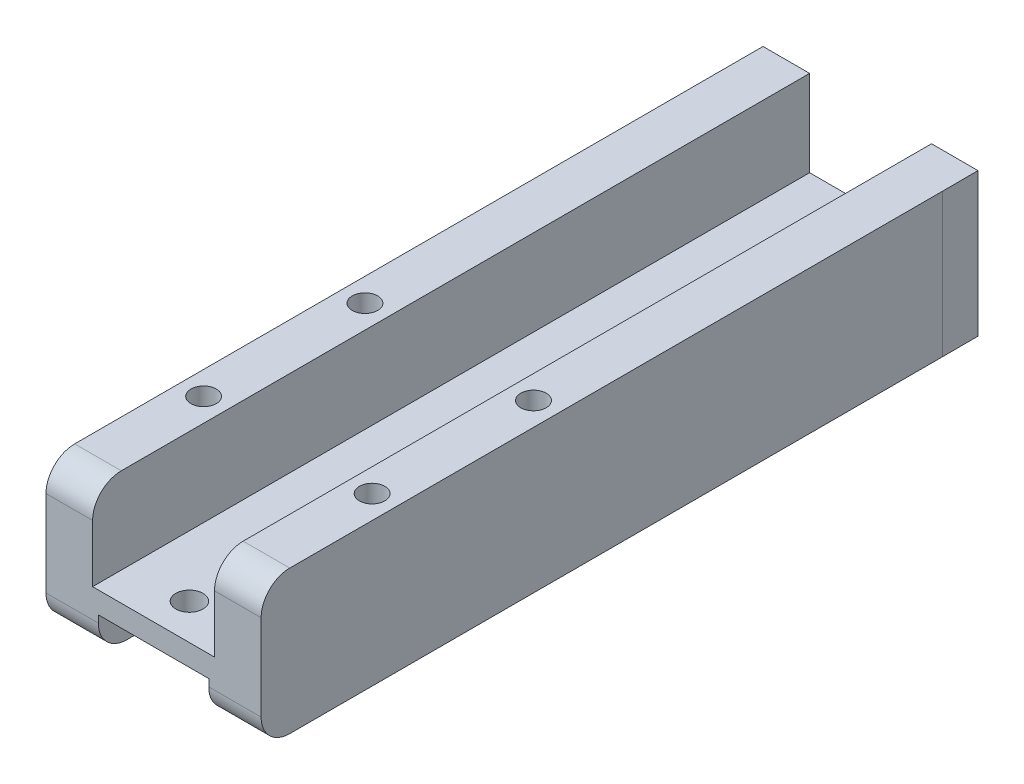
ISO-10303-21;
HEADER;
FILE_DESCRIPTION(('STEP AP214'),'2;1');
FILE_NAME('part.step','',(''),(''),'','','');
FILE_SCHEMA(('AUTOMOTIVE_DESIGN { 1 0 10303 214 1 1 1 1 }'));
ENDSEC;
DATA;
#1=APPLICATION_CONTEXT('core data for automotive mechanical design processes');
#2=APPLICATION_PROTOCOL_DEFINITION('international standard','automotive_design',2000,#1);
#3=PRODUCT_CONTEXT('',#1,'mechanical');
#4=PRODUCT('Part','Part','',(#3));
#5=PRODUCT_RELATED_PRODUCT_CATEGORY('part','',(#4));
#6=PRODUCT_DEFINITION_FORMATION('','',#4);
#7=PRODUCT_DEFINITION_CONTEXT('part definition',#1,'design');
#8=PRODUCT_DEFINITION('design','',#6,#7);
#9=PRODUCT_DEFINITION_SHAPE('','',#8);
#10=(LENGTH_UNIT() NAMED_UNIT(*) SI_UNIT(.MILLI.,.METRE.));
#11=(NAMED_UNIT(*) PLANE_ANGLE_UNIT() SI_UNIT($,.RADIAN.));
#12=(NAMED_UNIT(*) SI_UNIT($,.STERADIAN.) SOLID_ANGLE_UNIT());
#13=UNCERTAINTY_MEASURE_WITH_UNIT(LENGTH_MEASURE(1.E-05),#10,'distance_accuracy_value','');
#14=(GEOMETRIC_REPRESENTATION_CONTEXT(3) GLOBAL_UNCERTAINTY_ASSIGNED_CONTEXT((#13)) GLOBAL_UNIT_ASSIGNED_CONTEXT((#10,
#11,#12)) REPRESENTATION_CONTEXT('',''));
#15=CARTESIAN_POINT('',(0.,0.,0.));
#16=DIRECTION('',(0.,0.,1.));
#17=DIRECTION('',(1.,0.,0.));
#18=AXIS2_PLACEMENT_3D('',#15,#16,#17);
#19=CARTESIAN_POINT('',(0.,0.,0.));
#20=DIRECTION('',(0.,1.,0.));
#21=DIRECTION('',(0.,0.,1.));
#22=AXIS2_PLACEMENT_3D('',#19,#20,#21);
#23=PLANE('',#22);
#24=CARTESIAN_POINT('',(14.9225,0.,7.95562815682645));
#25=DIRECTION('',(0.,1.,0.));
#26=DIRECTION('',(0.,0.,1.));
#27=AXIS2_PLACEMENT_3D('',#24,#25,#26);
#28=CIRCLE('',#27,2.2479);
#29=CARTESIAN_POINT('',(14.9225,0.,10.2035281568264));
#30=VERTEX_POINT('',#29);
#31=EDGE_CURVE('E451',#30,#30,#28,.T.);
#32=ORIENTED_EDGE('',*,*,#31,.T.);
#33=EDGE_LOOP('',(#32));
#34=FACE_BOUND('',#33,.T.);
#35=CARTESIAN_POINT('',(14.9225,0.,36.5306281568265));
#36=DIRECTION('',(0.,1.,0.));
#37=DIRECTION('',(0.,0.,1.));
#38=AXIS2_PLACEMENT_3D('',#35,#36,#37);
#39=CIRCLE('',#38,2.2479);
#40=CARTESIAN_POINT('',(14.9225,0.,38.7785281568264));
#41=VERTEX_POINT('',#40);
#42=EDGE_CURVE('E456',#41,#41,#39,.T.);
#43=ORIENTED_EDGE('',*,*,#42,.T.);
#44=EDGE_LOOP('',(#43));
#45=FACE_BOUND('',#44,.T.);
#46=DIRECTION('',(0.,0.,-1.));
#47=VECTOR('',#46,1.);
#48=CARTESIAN_POINT('',(19.05,0.,60.325));
#49=LINE('',#48,#47);
#50=CARTESIAN_POINT('',(19.05,0.,55.245));
#51=VERTEX_POINT('',#50);
#52=CARTESIAN_POINT('',(19.05,0.,-60.325));
#53=VERTEX_POINT('',#52);
#54=EDGE_CURVE('E236',#51,#53,#49,.T.);
#55=ORIENTED_EDGE('',*,*,#54,.F.);
#56=DIRECTION('',(1.,0.,0.));
#57=VECTOR('',#56,1.);
#58=CARTESIAN_POINT('',(0.,0.,55.245));
#59=LINE('',#58,#57);
#60=CARTESIAN_POINT('',(9.779,0.,55.245));
#61=VERTEX_POINT('',#60);
#62=EDGE_CURVE('E61',#51,#61,#59,.F.);
#63=ORIENTED_EDGE('',*,*,#62,.T.);
#64=DIRECTION('',(0.,0.,-1.));
#65=VECTOR('',#64,1.);
#66=CARTESIAN_POINT('',(9.779,0.,0.));
#67=LINE('',#66,#65);
#68=CARTESIAN_POINT('',(9.779,0.,-66.675));
#69=VERTEX_POINT('',#68);
#70=EDGE_CURVE('E260',#61,#69,#67,.T.);
#71=ORIENTED_EDGE('',*,*,#70,.T.);
#72=DIRECTION('',(-1.,0.,0.));
#73=VECTOR('',#72,1.);
#74=CARTESIAN_POINT('',(-19.05,0.,-66.675));
#75=LINE('',#74,#73);
#76=CARTESIAN_POINT('',(19.0294614987353,0.,-66.675));
#77=VERTEX_POINT('',#76);
#78=EDGE_CURVE('E180',#77,#69,#75,.T.);
#79=ORIENTED_EDGE('',*,*,#78,.F.);
#80=DIRECTION('',(-0.00323439272988773,0.,-0.999994769338155));
#81=VECTOR('',#80,1.);
#82=CARTESIAN_POINT('',(19.0294614987353,0.,-66.675));
#83=LINE('',#82,#81);
#84=EDGE_CURVE('E228',#53,#77,#83,.T.);
#85=ORIENTED_EDGE('',*,*,#84,.F.);
#86=EDGE_LOOP('',(#55,#63,#71,#79,#85));
#87=FACE_BOUND('',#86,.T.);
#88=ADVANCED_FACE('F39',(#34,#45,#87),#23,.F.);
#89=CARTESIAN_POINT('',(19.0294614987353,38.1,-66.675));
#90=DIRECTION('',(-0.999994769338154,0.,0.00323439272988773));
#91=DIRECTION('',(0.00323439272988773,0.,0.999994769338155));
#92=AXIS2_PLACEMENT_3D('',#89,#90,#91);
#93=PLANE('',#92);
#94=DIRECTION('',(0.,-1.,0.));
#95=VECTOR('',#94,1.);
#96=CARTESIAN_POINT('',(19.0294614987353,38.1,-66.675));
#97=LINE('',#96,#95);
#98=CARTESIAN_POINT('',(19.0294614987353,25.4,-66.675));
#99=VERTEX_POINT('',#98);
#100=EDGE_CURVE('E250',#99,#77,#97,.T.);
#101=ORIENTED_EDGE('',*,*,#100,.F.);
#102=DIRECTION('',(0.00323439272988773,0.,0.999994769338155));
#103=VECTOR('',#102,1.);
#104=CARTESIAN_POINT('',(19.0294614987353,25.4,-66.675));
#105=LINE('',#104,#103);
#106=CARTESIAN_POINT('',(19.05,25.4,-60.325));
#107=VERTEX_POINT('',#106);
#108=EDGE_CURVE('E206',#99,#107,#105,.T.);
#109=ORIENTED_EDGE('',*,*,#108,.T.);
#110=DIRECTION('',(0.,-1.,0.));
#111=VECTOR('',#110,1.);
#112=CARTESIAN_POINT('',(19.05,38.1,-60.325));
#113=LINE('',#112,#111);
#114=EDGE_CURVE('E238',#107,#53,#113,.T.);
#115=ORIENTED_EDGE('',*,*,#114,.T.);
#116=ORIENTED_EDGE('',*,*,#84,.T.);
#117=EDGE_LOOP('',(#101,#109,#115,#116));
#118=FACE_BOUND('',#117,.T.);
#119=ADVANCED_FACE('F315',(#118),#93,.F.);
#120=CARTESIAN_POINT('',(-19.05,38.1,-66.675));
#121=DIRECTION('',(0.,0.,1.));
#122=DIRECTION('',(1.,0.,0.));
#123=AXIS2_PLACEMENT_3D('',#120,#121,#122);
#124=PLANE('',#123);
#125=ORIENTED_EDGE('',*,*,#78,.T.);
#126=DIRECTION('',(0.,1.,0.));
#127=VECTOR('',#126,1.);
#128=CARTESIAN_POINT('',(9.779,-6.35,-66.675));
#129=LINE('',#128,#127);
#130=CARTESIAN_POINT('',(9.779,6.35,-66.675));
#131=VERTEX_POINT('',#130);
#132=EDGE_CURVE('E161',#69,#131,#129,.T.);
#133=ORIENTED_EDGE('',*,*,#132,.T.);
#134=DIRECTION('',(-1.,0.,0.));
#135=VECTOR('',#134,1.);
#136=CARTESIAN_POINT('',(-9.779,6.35,-66.675));
#137=LINE('',#136,#135);
#138=CARTESIAN_POINT('',(-9.779,6.35,-66.675));
#139=VERTEX_POINT('',#138);
#140=EDGE_CURVE('E172',#131,#139,#137,.T.);
#141=ORIENTED_EDGE('',*,*,#140,.T.);
#142=DIRECTION('',(0.,-1.,0.));
#143=VECTOR('',#142,1.);
#144=CARTESIAN_POINT('',(-9.779,-6.35,-66.675));
#145=LINE('',#144,#143);
#146=CARTESIAN_POINT('',(-9.779,0.,-66.675));
#147=VERTEX_POINT('',#146);
#148=EDGE_CURVE('E169',#139,#147,#145,.T.);
#149=ORIENTED_EDGE('',*,*,#148,.T.);
#150=CARTESIAN_POINT('',(-19.05,0.,-66.675));
#151=VERTEX_POINT('',#150);
#152=EDGE_CURVE('E231',#147,#151,#75,.T.);
#153=ORIENTED_EDGE('',*,*,#152,.T.);
#154=DIRECTION('',(0.,-1.,0.));
#155=VECTOR('',#154,1.);
#156=CARTESIAN_POINT('',(-19.05,38.1,-66.675));
#157=LINE('',#156,#155);
#158=CARTESIAN_POINT('',(-19.05,25.4,-66.675));
#159=VERTEX_POINT('',#158);
#160=EDGE_CURVE('E247',#159,#151,#157,.T.);
#161=ORIENTED_EDGE('',*,*,#160,.F.);
#162=DIRECTION('',(1.,0.,0.));
#163=VECTOR('',#162,1.);
#164=CARTESIAN_POINT('',(-19.05,25.4,-66.675));
#165=LINE('',#164,#163);
#166=CARTESIAN_POINT('',(-10.795,25.4,-66.675));
#167=VERTEX_POINT('',#166);
#168=EDGE_CURVE('E198',#159,#167,#165,.T.);
#169=ORIENTED_EDGE('',*,*,#168,.T.);
#170=DIRECTION('',(0.,-1.,0.));
#171=VECTOR('',#170,1.);
#172=CARTESIAN_POINT('',(-10.795,38.1,-66.675));
#173=LINE('',#172,#171);
#174=CARTESIAN_POINT('',(-10.795,10.16,-66.675));
#175=VERTEX_POINT('',#174);
#176=EDGE_CURVE('E218',#167,#175,#173,.T.);
#177=ORIENTED_EDGE('',*,*,#176,.T.);
#178=DIRECTION('',(1.,0.,0.));
#179=VECTOR('',#178,1.);
#180=CARTESIAN_POINT('',(-19.05,10.16,-66.675));
#181=LINE('',#180,#179);
#182=CARTESIAN_POINT('',(10.795,10.16,-66.675));
#183=VERTEX_POINT('',#182);
#184=EDGE_CURVE('E225',#175,#183,#181,.T.);
#185=ORIENTED_EDGE('',*,*,#184,.T.);
#186=DIRECTION('',(0.,1.,0.));
#187=VECTOR('',#186,1.);
#188=CARTESIAN_POINT('',(10.795,38.1,-66.675));
#189=LINE('',#188,#187);
#190=CARTESIAN_POINT('',(10.795,25.4,-66.675));
#191=VERTEX_POINT('',#190);
#192=EDGE_CURVE('E222',#183,#191,#189,.T.);
#193=ORIENTED_EDGE('',*,*,#192,.T.);
#194=EDGE_CURVE('E204',#191,#99,#165,.T.);
#195=ORIENTED_EDGE('',*,*,#194,.T.);
#196=ORIENTED_EDGE('',*,*,#100,.T.);
#197=EDGE_LOOP('',(#125,#133,#141,#149,#153,#161,#169,#177,#185,#193,#195,#196));
#198=FACE_BOUND('',#197,.T.);
#199=ADVANCED_FACE('F178',(#198),#124,.F.);
#200=CARTESIAN_POINT('',(-19.05,38.1,60.325));
#201=DIRECTION('',(1.,0.,0.));
#202=DIRECTION('',(0.,0.,-1.));
#203=AXIS2_PLACEMENT_3D('',#200,#201,#202);
#204=PLANE('',#203);
#205=DIRECTION('',(0.,-1.,0.));
#206=VECTOR('',#205,1.);
#207=CARTESIAN_POINT('',(-19.05,38.1,60.325));
#208=LINE('',#207,#206);
#209=CARTESIAN_POINT('',(-19.05,20.32,60.325));
#210=VERTEX_POINT('',#209);
#211=CARTESIAN_POINT('',(-19.05,5.08000000000002,60.325));
#212=VERTEX_POINT('',#211);
#213=EDGE_CURVE('E244',#210,#212,#208,.T.);
#214=ORIENTED_EDGE('',*,*,#213,.F.);
#215=CARTESIAN_POINT('',(-19.05,20.32,55.245));
#216=DIRECTION('',(1.,0.,0.));
#217=DIRECTION('',(0.,0.,-1.));
#218=AXIS2_PLACEMENT_3D('',#215,#216,#217);
#219=CIRCLE('',#218,5.08);
#220=CARTESIAN_POINT('',(-19.05,25.4,55.245));
#221=VERTEX_POINT('',#220);
#222=EDGE_CURVE('E293',#210,#221,#219,.F.);
#223=ORIENTED_EDGE('',*,*,#222,.T.);
#224=DIRECTION('',(0.,0.,1.));
#225=VECTOR('',#224,1.);
#226=CARTESIAN_POINT('',(-19.05,25.4,60.325));
#227=LINE('',#226,#225);
#228=EDGE_CURVE('E193',#159,#221,#227,.T.);
#229=ORIENTED_EDGE('',*,*,#228,.F.);
#230=ORIENTED_EDGE('',*,*,#160,.T.);
#231=DIRECTION('',(0.,0.,1.));
#232=VECTOR('',#231,1.);
#233=CARTESIAN_POINT('',(-19.05,0.,60.325));
#234=LINE('',#233,#232);
#235=CARTESIAN_POINT('',(-19.05,0.,55.245));
#236=VERTEX_POINT('',#235);
#237=EDGE_CURVE('E233',#151,#236,#234,.T.);
#238=ORIENTED_EDGE('',*,*,#237,.T.);
#239=CARTESIAN_POINT('',(-19.05,5.08,55.245));
#240=DIRECTION('',(1.,0.,0.));
#241=DIRECTION('',(0.,0.,-1.));
#242=AXIS2_PLACEMENT_3D('',#239,#240,#241);
#243=CIRCLE('',#242,5.08);
#244=EDGE_CURVE('E291',#236,#212,#243,.F.);
#245=ORIENTED_EDGE('',*,*,#244,.T.);
#246=EDGE_LOOP('',(#214,#223,#229,#230,#238,#245));
#247=FACE_BOUND('',#246,.T.);
#248=ADVANCED_FACE('F345',(#247),#204,.F.);
#249=CARTESIAN_POINT('',(-19.05,38.1,60.325));
#250=DIRECTION('',(0.,0.,-1.));
#251=DIRECTION('',(-1.,0.,0.));
#252=AXIS2_PLACEMENT_3D('',#249,#250,#251);
#253=PLANE('',#252);
#254=DIRECTION('',(0.,-1.,0.));
#255=VECTOR('',#254,1.);
#256=CARTESIAN_POINT('',(19.05,38.1,60.325));
#257=LINE('',#256,#255);
#258=CARTESIAN_POINT('',(19.05,20.32,60.325));
#259=VERTEX_POINT('',#258);
#260=CARTESIAN_POINT('',(19.05,5.08000000000002,60.325));
#261=VERTEX_POINT('',#260);
#262=EDGE_CURVE('E241',#259,#261,#257,.T.);
#263=ORIENTED_EDGE('',*,*,#262,.F.);
#264=DIRECTION('',(-1.,0.,0.));
#265=VECTOR('',#264,1.);
#266=CARTESIAN_POINT('',(-19.05,20.32,60.325));
#267=LINE('',#266,#265);
#268=CARTESIAN_POINT('',(10.795,20.32,60.325));
#269=VERTEX_POINT('',#268);
#270=EDGE_CURVE('E280',#259,#269,#267,.T.);
#271=ORIENTED_EDGE('',*,*,#270,.T.);
#272=DIRECTION('',(0.,-1.,0.));
#273=VECTOR('',#272,1.);
#274=CARTESIAN_POINT('',(10.795,38.1,60.325));
#275=LINE('',#274,#273);
#276=CARTESIAN_POINT('',(10.795,10.16,60.325));
#277=VERTEX_POINT('',#276);
#278=EDGE_CURVE('E220',#269,#277,#275,.T.);
#279=ORIENTED_EDGE('',*,*,#278,.T.);
#280=DIRECTION('',(-1.,0.,0.));
#281=VECTOR('',#280,1.);
#282=CARTESIAN_POINT('',(-19.05,10.16,60.325));
#283=LINE('',#282,#281);
#284=CARTESIAN_POINT('',(-10.795,10.16,60.325));
#285=VERTEX_POINT('',#284);
#286=EDGE_CURVE('E252',#277,#285,#283,.T.);
#287=ORIENTED_EDGE('',*,*,#286,.T.);
#288=DIRECTION('',(0.,1.,0.));
#289=VECTOR('',#288,1.);
#290=CARTESIAN_POINT('',(-10.795,38.1,60.325));
#291=LINE('',#290,#289);
#292=CARTESIAN_POINT('',(-10.795,20.32,60.325));
#293=VERTEX_POINT('',#292);
#294=EDGE_CURVE('E215',#285,#293,#291,.T.);
#295=ORIENTED_EDGE('',*,*,#294,.T.);
#296=DIRECTION('',(-1.,0.,0.));
#297=VECTOR('',#296,1.);
#298=CARTESIAN_POINT('',(-19.05,20.32,60.325));
#299=LINE('',#298,#297);
#300=EDGE_CURVE('E277',#293,#210,#299,.T.);
#301=ORIENTED_EDGE('',*,*,#300,.T.);
#302=ORIENTED_EDGE('',*,*,#213,.T.);
#303=DIRECTION('',(1.,0.,0.));
#304=VECTOR('',#303,1.);
#305=CARTESIAN_POINT('',(-19.05,5.08,60.325));
#306=LINE('',#305,#304);
#307=CARTESIAN_POINT('',(-9.779,5.08,60.325));
#308=VERTEX_POINT('',#307);
#309=EDGE_CURVE('E262',#212,#308,#306,.T.);
#310=ORIENTED_EDGE('',*,*,#309,.T.);
#311=DIRECTION('',(0.,-1.,0.));
#312=VECTOR('',#311,1.);
#313=CARTESIAN_POINT('',(-9.779,-6.35,60.325));
#314=LINE('',#313,#312);
#315=CARTESIAN_POINT('',(-9.779,6.35,60.325));
#316=VERTEX_POINT('',#315);
#317=EDGE_CURVE('E181',#316,#308,#314,.T.);
#318=ORIENTED_EDGE('',*,*,#317,.F.);
#319=DIRECTION('',(-1.,0.,0.));
#320=VECTOR('',#319,1.);
#321=CARTESIAN_POINT('',(-9.779,6.35,60.325));
#322=LINE('',#321,#320);
#323=CARTESIAN_POINT('',(9.779,6.35,60.325));
#324=VERTEX_POINT('',#323);
#325=EDGE_CURVE('E183',#324,#316,#322,.T.);
#326=ORIENTED_EDGE('',*,*,#325,.F.);
#327=DIRECTION('',(0.,1.,0.));
#328=VECTOR('',#327,1.);
#329=CARTESIAN_POINT('',(9.779,-6.35,60.325));
#330=LINE('',#329,#328);
#331=CARTESIAN_POINT('',(9.779,5.08,60.325));
#332=VERTEX_POINT('',#331);
#333=EDGE_CURVE('E164',#332,#324,#330,.T.);
#334=ORIENTED_EDGE('',*,*,#333,.F.);
#335=DIRECTION('',(1.,0.,0.));
#336=VECTOR('',#335,1.);
#337=CARTESIAN_POINT('',(-19.05,5.08,60.325));
#338=LINE('',#337,#336);
#339=EDGE_CURVE('E274',#332,#261,#338,.T.);
#340=ORIENTED_EDGE('',*,*,#339,.T.);
#341=EDGE_LOOP('',(#263,#271,#279,#287,#295,#301,#302,#310,#318,#326,#334,#340));
#342=FACE_BOUND('',#341,.T.);
#343=ADVANCED_FACE('F306',(#342),#253,.F.);
#344=CARTESIAN_POINT('',(19.05,38.1,60.325));
#345=DIRECTION('',(-1.,0.,0.));
#346=DIRECTION('',(0.,0.,1.));
#347=AXIS2_PLACEMENT_3D('',#344,#345,#346);
#348=PLANE('',#347);
#349=DIRECTION('',(0.,0.,1.));
#350=VECTOR('',#349,1.);
#351=CARTESIAN_POINT('',(19.05,25.4,-71.3772741349769));
#352=LINE('',#351,#350);
#353=CARTESIAN_POINT('',(19.05,25.4,55.245));
#354=VERTEX_POINT('',#353);
#355=EDGE_CURVE('E195',#107,#354,#352,.T.);
#356=ORIENTED_EDGE('',*,*,#355,.T.);
#357=CARTESIAN_POINT('',(19.05,20.32,55.245));
#358=DIRECTION('',(-1.,0.,0.));
#359=DIRECTION('',(0.,0.,1.));
#360=AXIS2_PLACEMENT_3D('',#357,#358,#359);
#361=CIRCLE('',#360,5.08);
#362=EDGE_CURVE('E289',#354,#259,#361,.F.);
#363=ORIENTED_EDGE('',*,*,#362,.T.);
#364=ORIENTED_EDGE('',*,*,#262,.T.);
#365=CARTESIAN_POINT('',(19.05,5.08,55.245));
#366=DIRECTION('',(-1.,0.,0.));
#367=DIRECTION('',(0.,0.,1.));
#368=AXIS2_PLACEMENT_3D('',#365,#366,#367);
#369=CIRCLE('',#368,5.08);
#370=EDGE_CURVE('E287',#261,#51,#369,.F.);
#371=ORIENTED_EDGE('',*,*,#370,.T.);
#372=ORIENTED_EDGE('',*,*,#54,.T.);
#373=ORIENTED_EDGE('',*,*,#114,.F.);
#374=EDGE_LOOP('',(#356,#363,#364,#371,#372,#373));
#375=FACE_BOUND('',#374,.T.);
#376=ADVANCED_FACE('F310',(#375),#348,.F.);
#377=CARTESIAN_POINT('',(-14.9225,0.,36.5306281568265));
#378=DIRECTION('',(0.,1.,0.));
#379=DIRECTION('',(0.,0.,1.));
#380=AXIS2_PLACEMENT_3D('',#377,#378,#379);
#381=CIRCLE('',#380,2.24789999999999);
#382=CARTESIAN_POINT('',(-14.9225,0.,38.7785281568265));
#383=VERTEX_POINT('',#382);
#384=EDGE_CURVE('E387',#383,#383,#381,.T.);
#385=ORIENTED_EDGE('',*,*,#384,.T.);
#386=EDGE_LOOP('',(#385));
#387=FACE_BOUND('',#386,.T.);
#388=CARTESIAN_POINT('',(-14.9225,0.,7.95562815682647));
#389=DIRECTION('',(0.,1.,0.));
#390=DIRECTION('',(0.,0.,1.));
#391=AXIS2_PLACEMENT_3D('',#388,#389,#390);
#392=CIRCLE('',#391,2.24789999999999);
#393=CARTESIAN_POINT('',(-14.9225,0.,10.2035281568265));
#394=VERTEX_POINT('',#393);
#395=EDGE_CURVE('E391',#394,#394,#392,.T.);
#396=ORIENTED_EDGE('',*,*,#395,.T.);
#397=EDGE_LOOP('',(#396));
#398=FACE_BOUND('',#397,.T.);
#399=DIRECTION('',(0.,0.,1.));
#400=VECTOR('',#399,1.);
#401=CARTESIAN_POINT('',(-9.779,0.,0.));
#402=LINE('',#401,#400);
#403=CARTESIAN_POINT('',(-9.779,0.,55.245));
#404=VERTEX_POINT('',#403);
#405=EDGE_CURVE('E258',#147,#404,#402,.T.);
#406=ORIENTED_EDGE('',*,*,#405,.T.);
#407=DIRECTION('',(1.,0.,0.));
#408=VECTOR('',#407,1.);
#409=CARTESIAN_POINT('',(0.,0.,55.245));
#410=LINE('',#409,#408);
#411=EDGE_CURVE('E11',#404,#236,#410,.F.);
#412=ORIENTED_EDGE('',*,*,#411,.T.);
#413=ORIENTED_EDGE('',*,*,#237,.F.);
#414=ORIENTED_EDGE('',*,*,#152,.F.);
#415=EDGE_LOOP('',(#406,#412,#413,#414));
#416=FACE_BOUND('',#415,.T.);
#417=ADVANCED_FACE('F365',(#387,#398,#416),#23,.F.);
#418=CARTESIAN_POINT('',(0.,10.16,0.));
#419=DIRECTION('',(0.,-1.,0.));
#420=DIRECTION('',(0.,0.,-1.));
#421=AXIS2_PLACEMENT_3D('',#418,#419,#420);
#422=PLANE('',#421);
#423=CARTESIAN_POINT('',(0.,10.16,53.975));
#424=DIRECTION('',(0.,1.,0.));
#425=DIRECTION('',(0.,0.,1.));
#426=AXIS2_PLACEMENT_3D('',#423,#424,#425);
#427=CIRCLE('',#426,2.413);
#428=CARTESIAN_POINT('',(0.,10.16,56.388));
#429=VERTEX_POINT('',#428);
#430=EDGE_CURVE('E267',#429,#429,#427,.T.);
#431=ORIENTED_EDGE('',*,*,#430,.F.);
#432=EDGE_LOOP('',(#431));
#433=FACE_BOUND('',#432,.T.);
#434=CARTESIAN_POINT('',(0.,10.16,-47.625));
#435=DIRECTION('',(0.,1.,0.));
#436=DIRECTION('',(0.,0.,1.));
#437=AXIS2_PLACEMENT_3D('',#434,#435,#436);
#438=CIRCLE('',#437,2.413);
#439=CARTESIAN_POINT('',(0.,10.16,-45.212));
#440=VERTEX_POINT('',#439);
#441=EDGE_CURVE('E460',#440,#440,#438,.T.);
#442=ORIENTED_EDGE('',*,*,#441,.F.);
#443=EDGE_LOOP('',(#442));
#444=FACE_BOUND('',#443,.T.);
#445=CARTESIAN_POINT('',(0.,10.16,3.17499999999998));
#446=DIRECTION('',(0.,1.,0.));
#447=DIRECTION('',(0.,0.,1.));
#448=AXIS2_PLACEMENT_3D('',#445,#446,#447);
#449=CIRCLE('',#448,2.413);
#450=CARTESIAN_POINT('',(0.,10.16,5.58799999999998));
#451=VERTEX_POINT('',#450);
#452=EDGE_CURVE('E186',#451,#451,#449,.T.);
#453=ORIENTED_EDGE('',*,*,#452,.F.);
#454=EDGE_LOOP('',(#453));
#455=FACE_BOUND('',#454,.T.);
#456=DIRECTION('',(0.,0.,1.));
#457=VECTOR('',#456,1.);
#458=CARTESIAN_POINT('',(-10.795,10.16,158.75));
#459=LINE('',#458,#457);
#460=EDGE_CURVE('E212',#175,#285,#459,.T.);
#461=ORIENTED_EDGE('',*,*,#460,.T.);
#462=ORIENTED_EDGE('',*,*,#286,.F.);
#463=DIRECTION('',(0.,0.,-1.));
#464=VECTOR('',#463,1.);
#465=CARTESIAN_POINT('',(10.795,10.16,158.75));
#466=LINE('',#465,#464);
#467=EDGE_CURVE('E209',#277,#183,#466,.T.);
#468=ORIENTED_EDGE('',*,*,#467,.T.);
#469=ORIENTED_EDGE('',*,*,#184,.F.);
#470=EDGE_LOOP('',(#461,#462,#468,#469));
#471=FACE_BOUND('',#470,.T.);
#472=ADVANCED_FACE('F330',(#433,#444,#455,#471),#422,.F.);
#473=CARTESIAN_POINT('',(10.795,10.16,158.75));
#474=DIRECTION('',(1.,0.,0.));
#475=DIRECTION('',(0.,0.,-1.));
#476=AXIS2_PLACEMENT_3D('',#473,#474,#475);
#477=PLANE('',#476);
#478=ORIENTED_EDGE('',*,*,#278,.F.);
#479=CARTESIAN_POINT('',(10.795,20.32,55.245));
#480=DIRECTION('',(1.,0.,0.));
#481=DIRECTION('',(0.,0.,-1.));
#482=AXIS2_PLACEMENT_3D('',#479,#480,#481);
#483=CIRCLE('',#482,5.08);
#484=CARTESIAN_POINT('',(10.795,25.4,55.245));
#485=VERTEX_POINT('',#484);
#486=EDGE_CURVE('E283',#269,#485,#483,.F.);
#487=ORIENTED_EDGE('',*,*,#486,.T.);
#488=DIRECTION('',(0.,0.,-1.));
#489=VECTOR('',#488,1.);
#490=CARTESIAN_POINT('',(10.795,25.4,158.75));
#491=LINE('',#490,#489);
#492=EDGE_CURVE('E203',#485,#191,#491,.T.);
#493=ORIENTED_EDGE('',*,*,#492,.T.);
#494=ORIENTED_EDGE('',*,*,#192,.F.);
#495=ORIENTED_EDGE('',*,*,#467,.F.);
#496=EDGE_LOOP('',(#478,#487,#493,#494,#495));
#497=FACE_BOUND('',#496,.T.);
#498=ADVANCED_FACE('F326',(#497),#477,.F.);
#499=CARTESIAN_POINT('',(-10.795,10.16,158.75));
#500=DIRECTION('',(-1.,0.,0.));
#501=DIRECTION('',(0.,0.,1.));
#502=AXIS2_PLACEMENT_3D('',#499,#500,#501);
#503=PLANE('',#502);
#504=DIRECTION('',(0.,0.,1.));
#505=VECTOR('',#504,1.);
#506=CARTESIAN_POINT('',(-10.795,25.4,158.75));
#507=LINE('',#506,#505);
#508=CARTESIAN_POINT('',(-10.795,25.4,55.245));
#509=VERTEX_POINT('',#508);
#510=EDGE_CURVE('E255',#167,#509,#507,.T.);
#511=ORIENTED_EDGE('',*,*,#510,.T.);
#512=CARTESIAN_POINT('',(-10.795,20.32,55.245));
#513=DIRECTION('',(-1.,0.,0.));
#514=DIRECTION('',(0.,0.,1.));
#515=AXIS2_PLACEMENT_3D('',#512,#513,#514);
#516=CIRCLE('',#515,5.08);
#517=EDGE_CURVE('E297',#509,#293,#516,.F.);
#518=ORIENTED_EDGE('',*,*,#517,.T.);
#519=ORIENTED_EDGE('',*,*,#294,.F.);
#520=ORIENTED_EDGE('',*,*,#460,.F.);
#521=ORIENTED_EDGE('',*,*,#176,.F.);
#522=EDGE_LOOP('',(#511,#518,#519,#520,#521));
#523=FACE_BOUND('',#522,.T.);
#524=ADVANCED_FACE('F336',(#523),#503,.F.);
#525=CARTESIAN_POINT('',(19.05,25.4,60.325));
#526=DIRECTION('',(0.,-1.,0.));
#527=DIRECTION('',(0.,0.,-1.));
#528=AXIS2_PLACEMENT_3D('',#525,#526,#527);
#529=PLANE('',#528);
#530=CARTESIAN_POINT('',(-14.9225,25.4,36.5306281568265));
#531=DIRECTION('',(0.,1.,0.));
#532=DIRECTION('',(0.,0.,1.));
#533=AXIS2_PLACEMENT_3D('',#530,#531,#532);
#534=CIRCLE('',#533,2.24789999999999);
#535=CARTESIAN_POINT('',(-14.9225,25.4,38.7785281568264));
#536=VERTEX_POINT('',#535);
#537=EDGE_CURVE('E440',#536,#536,#534,.T.);
#538=ORIENTED_EDGE('',*,*,#537,.F.);
#539=EDGE_LOOP('',(#538));
#540=FACE_BOUND('',#539,.T.);
#541=CARTESIAN_POINT('',(-14.9225,25.4,7.95562815682647));
#542=DIRECTION('',(0.,1.,0.));
#543=DIRECTION('',(0.,0.,1.));
#544=AXIS2_PLACEMENT_3D('',#541,#542,#543);
#545=CIRCLE('',#544,2.24789999999999);
#546=CARTESIAN_POINT('',(-14.9225,25.4,10.2035281568265));
#547=VERTEX_POINT('',#546);
#548=EDGE_CURVE('E442',#547,#547,#545,.T.);
#549=ORIENTED_EDGE('',*,*,#548,.F.);
#550=EDGE_LOOP('',(#549));
#551=FACE_BOUND('',#550,.T.);
#552=ORIENTED_EDGE('',*,*,#228,.T.);
#553=DIRECTION('',(-1.,0.,0.));
#554=VECTOR('',#553,1.);
#555=CARTESIAN_POINT('',(19.05,25.4,55.245));
#556=LINE('',#555,#554);
#557=EDGE_CURVE('E295',#221,#509,#556,.F.);
#558=ORIENTED_EDGE('',*,*,#557,.T.);
#559=ORIENTED_EDGE('',*,*,#510,.F.);
#560=ORIENTED_EDGE('',*,*,#168,.F.);
#561=EDGE_LOOP('',(#552,#558,#559,#560));
#562=FACE_BOUND('',#561,.T.);
#563=ADVANCED_FACE('F347',(#540,#551,#562),#529,.F.);
#564=CARTESIAN_POINT('',(14.9225,25.4,7.95562815682645));
#565=DIRECTION('',(0.,1.,0.));
#566=DIRECTION('',(0.,0.,1.));
#567=AXIS2_PLACEMENT_3D('',#564,#565,#566);
#568=CIRCLE('',#567,2.24789999999998);
#569=CARTESIAN_POINT('',(14.9225,25.4,10.2035281568264));
#570=VERTEX_POINT('',#569);
#571=EDGE_CURVE('E448',#570,#570,#568,.T.);
#572=ORIENTED_EDGE('',*,*,#571,.F.);
#573=EDGE_LOOP('',(#572));
#574=FACE_BOUND('',#573,.T.);
#575=CARTESIAN_POINT('',(14.9225,25.4,36.5306281568265));
#576=DIRECTION('',(0.,1.,0.));
#577=DIRECTION('',(0.,0.,1.));
#578=AXIS2_PLACEMENT_3D('',#575,#576,#577);
#579=CIRCLE('',#578,2.24789999999999);
#580=CARTESIAN_POINT('',(14.9225,25.4,38.7785281568264));
#581=VERTEX_POINT('',#580);
#582=EDGE_CURVE('E453',#581,#581,#579,.T.);
#583=ORIENTED_EDGE('',*,*,#582,.F.);
#584=EDGE_LOOP('',(#583));
#585=FACE_BOUND('',#584,.T.);
#586=ORIENTED_EDGE('',*,*,#492,.F.);
#587=DIRECTION('',(-1.,0.,0.));
#588=VECTOR('',#587,1.);
#589=CARTESIAN_POINT('',(19.05,25.4,55.245));
#590=LINE('',#589,#588);
#591=EDGE_CURVE('E285',#485,#354,#590,.F.);
#592=ORIENTED_EDGE('',*,*,#591,.T.);
#593=ORIENTED_EDGE('',*,*,#355,.F.);
#594=ORIENTED_EDGE('',*,*,#108,.F.);
#595=ORIENTED_EDGE('',*,*,#194,.F.);
#596=EDGE_LOOP('',(#586,#592,#593,#594,#595));
#597=FACE_BOUND('',#596,.T.);
#598=ADVANCED_FACE('F349',(#574,#585,#597),#529,.F.);
#599=CARTESIAN_POINT('',(9.779,-6.35,-66.675));
#600=DIRECTION('',(1.,0.,0.));
#601=DIRECTION('',(0.,0.,-1.));
#602=AXIS2_PLACEMENT_3D('',#599,#600,#601);
#603=PLANE('',#602);
#604=ORIENTED_EDGE('',*,*,#70,.F.);
#605=CARTESIAN_POINT('',(9.779,5.08,55.245));
#606=DIRECTION('',(1.,0.,0.));
#607=DIRECTION('',(0.,0.,-1.));
#608=AXIS2_PLACEMENT_3D('',#605,#606,#607);
#609=CIRCLE('',#608,5.08);
#610=EDGE_CURVE('E300',#61,#332,#609,.F.);
#611=ORIENTED_EDGE('',*,*,#610,.T.);
#612=ORIENTED_EDGE('',*,*,#333,.T.);
#613=DIRECTION('',(0.,0.,1.));
#614=VECTOR('',#613,1.);
#615=CARTESIAN_POINT('',(9.779,6.35,-66.675));
#616=LINE('',#615,#614);
#617=EDGE_CURVE('E157',#131,#324,#616,.T.);
#618=ORIENTED_EDGE('',*,*,#617,.F.);
#619=ORIENTED_EDGE('',*,*,#132,.F.);
#620=EDGE_LOOP('',(#604,#611,#612,#618,#619));
#621=FACE_BOUND('',#620,.T.);
#622=ADVANCED_FACE('F159',(#621),#603,.F.);
#623=CARTESIAN_POINT('',(-9.779,-6.35,-66.675));
#624=DIRECTION('',(-1.,0.,0.));
#625=DIRECTION('',(0.,0.,1.));
#626=AXIS2_PLACEMENT_3D('',#623,#624,#625);
#627=PLANE('',#626);
#628=ORIENTED_EDGE('',*,*,#317,.T.);
#629=CARTESIAN_POINT('',(-9.779,5.08,55.245));
#630=DIRECTION('',(-1.,0.,0.));
#631=DIRECTION('',(0.,0.,1.));
#632=AXIS2_PLACEMENT_3D('',#629,#630,#631);
#633=CIRCLE('',#632,5.08);
#634=EDGE_CURVE('E47',#308,#404,#633,.F.);
#635=ORIENTED_EDGE('',*,*,#634,.T.);
#636=ORIENTED_EDGE('',*,*,#405,.F.);
#637=ORIENTED_EDGE('',*,*,#148,.F.);
#638=DIRECTION('',(0.,0.,1.));
#639=VECTOR('',#638,1.);
#640=CARTESIAN_POINT('',(-9.779,6.35,-66.675));
#641=LINE('',#640,#639);
#642=EDGE_CURVE('E168',#139,#316,#641,.T.);
#643=ORIENTED_EDGE('',*,*,#642,.T.);
#644=EDGE_LOOP('',(#628,#635,#636,#637,#643));
#645=FACE_BOUND('',#644,.T.);
#646=ADVANCED_FACE('F398',(#645),#627,.F.);
#647=CARTESIAN_POINT('',(-9.779,6.35,-66.675));
#648=DIRECTION('',(0.,1.,0.));
#649=DIRECTION('',(0.,0.,1.));
#650=AXIS2_PLACEMENT_3D('',#647,#648,#649);
#651=PLANE('',#650);
#652=CARTESIAN_POINT('',(0.,6.35,53.975));
#653=DIRECTION('',(0.,1.,0.));
#654=DIRECTION('',(0.,0.,1.));
#655=AXIS2_PLACEMENT_3D('',#652,#653,#654);
#656=CIRCLE('',#655,2.413);
#657=CARTESIAN_POINT('',(0.,6.35,56.388));
#658=VERTEX_POINT('',#657);
#659=EDGE_CURVE('E191',#658,#658,#656,.T.);
#660=ORIENTED_EDGE('',*,*,#659,.T.);
#661=EDGE_LOOP('',(#660));
#662=FACE_BOUND('',#661,.T.);
#663=CARTESIAN_POINT('',(0.,6.35,-47.625));
#664=DIRECTION('',(0.,1.,0.));
#665=DIRECTION('',(0.,0.,1.));
#666=AXIS2_PLACEMENT_3D('',#663,#664,#665);
#667=CIRCLE('',#666,2.413);
#668=CARTESIAN_POINT('',(0.,6.35,-45.212));
#669=VERTEX_POINT('',#668);
#670=EDGE_CURVE('E266',#669,#669,#667,.T.);
#671=ORIENTED_EDGE('',*,*,#670,.T.);
#672=EDGE_LOOP('',(#671));
#673=FACE_BOUND('',#672,.T.);
#674=CARTESIAN_POINT('',(0.,6.35,3.17499999999998));
#675=DIRECTION('',(0.,1.,0.));
#676=DIRECTION('',(0.,0.,1.));
#677=AXIS2_PLACEMENT_3D('',#674,#675,#676);
#678=CIRCLE('',#677,2.413);
#679=CARTESIAN_POINT('',(0.,6.35,5.58799999999998));
#680=VERTEX_POINT('',#679);
#681=EDGE_CURVE('E263',#680,#680,#678,.T.);
#682=ORIENTED_EDGE('',*,*,#681,.T.);
#683=EDGE_LOOP('',(#682));
#684=FACE_BOUND('',#683,.T.);
#685=ORIENTED_EDGE('',*,*,#325,.T.);
#686=ORIENTED_EDGE('',*,*,#642,.F.);
#687=ORIENTED_EDGE('',*,*,#140,.F.);
#688=ORIENTED_EDGE('',*,*,#617,.T.);
#689=EDGE_LOOP('',(#685,#686,#687,#688));
#690=FACE_BOUND('',#689,.T.);
#691=ADVANCED_FACE('F173',(#662,#673,#684,#690),#651,.F.);
#692=CARTESIAN_POINT('',(0.,0.,3.17499999999998));
#693=DIRECTION('',(0.,1.,0.));
#694=DIRECTION('',(0.,0.,1.));
#695=AXIS2_PLACEMENT_3D('',#692,#693,#694);
#696=CYLINDRICAL_SURFACE('',#695,2.413);
#697=ORIENTED_EDGE('',*,*,#452,.T.);
#698=EDGE_LOOP('',(#697));
#699=FACE_BOUND('',#698,.T.);
#700=ORIENTED_EDGE('',*,*,#681,.F.);
#701=EDGE_LOOP('',(#700));
#702=FACE_BOUND('',#701,.T.);
#703=ADVANCED_FACE('F406',(#699,#702),#696,.F.);
#704=CARTESIAN_POINT('',(0.,0.,-47.625));
#705=DIRECTION('',(0.,1.,0.));
#706=DIRECTION('',(0.,0.,1.));
#707=AXIS2_PLACEMENT_3D('',#704,#705,#706);
#708=CYLINDRICAL_SURFACE('',#707,2.413);
#709=ORIENTED_EDGE('',*,*,#441,.T.);
#710=EDGE_LOOP('',(#709));
#711=FACE_BOUND('',#710,.T.);
#712=ORIENTED_EDGE('',*,*,#670,.F.);
#713=EDGE_LOOP('',(#712));
#714=FACE_BOUND('',#713,.T.);
#715=ADVANCED_FACE('F412',(#711,#714),#708,.F.);
#716=CARTESIAN_POINT('',(0.,0.,53.975));
#717=DIRECTION('',(0.,1.,0.));
#718=DIRECTION('',(0.,0.,1.));
#719=AXIS2_PLACEMENT_3D('',#716,#717,#718);
#720=CYLINDRICAL_SURFACE('',#719,2.413);
#721=ORIENTED_EDGE('',*,*,#430,.T.);
#722=EDGE_LOOP('',(#721));
#723=FACE_BOUND('',#722,.T.);
#724=ORIENTED_EDGE('',*,*,#659,.F.);
#725=EDGE_LOOP('',(#724));
#726=FACE_BOUND('',#725,.T.);
#727=ADVANCED_FACE('F416',(#723,#726),#720,.F.);
#728=CARTESIAN_POINT('',(14.9225,25.4,36.5306281568265));
#729=DIRECTION('',(0.,1.,0.));
#730=DIRECTION('',(0.,0.,1.));
#731=AXIS2_PLACEMENT_3D('',#728,#729,#730);
#732=CYLINDRICAL_SURFACE('',#731,2.24789999999999);
#733=ORIENTED_EDGE('',*,*,#42,.F.);
#734=EDGE_LOOP('',(#733));
#735=FACE_BOUND('',#734,.T.);
#736=ORIENTED_EDGE('',*,*,#582,.T.);
#737=EDGE_LOOP('',(#736));
#738=FACE_BOUND('',#737,.T.);
#739=ADVANCED_FACE('F420',(#735,#738),#732,.F.);
#740=CARTESIAN_POINT('',(14.9225,25.4,7.95562815682645));
#741=DIRECTION('',(0.,1.,0.));
#742=DIRECTION('',(0.,0.,1.));
#743=AXIS2_PLACEMENT_3D('',#740,#741,#742);
#744=CYLINDRICAL_SURFACE('',#743,2.24789999999999);
#745=ORIENTED_EDGE('',*,*,#31,.F.);
#746=EDGE_LOOP('',(#745));
#747=FACE_BOUND('',#746,.T.);
#748=ORIENTED_EDGE('',*,*,#571,.T.);
#749=EDGE_LOOP('',(#748));
#750=FACE_BOUND('',#749,.T.);
#751=ADVANCED_FACE('F424',(#747,#750),#744,.F.);
#752=CARTESIAN_POINT('',(-14.9225,25.4,7.95562815682647));
#753=DIRECTION('',(0.,1.,0.));
#754=DIRECTION('',(0.,0.,1.));
#755=AXIS2_PLACEMENT_3D('',#752,#753,#754);
#756=CYLINDRICAL_SURFACE('',#755,2.24789999999999);
#757=ORIENTED_EDGE('',*,*,#395,.F.);
#758=EDGE_LOOP('',(#757));
#759=FACE_BOUND('',#758,.T.);
#760=ORIENTED_EDGE('',*,*,#548,.T.);
#761=EDGE_LOOP('',(#760));
#762=FACE_BOUND('',#761,.T.);
#763=ADVANCED_FACE('F428',(#759,#762),#756,.F.);
#764=CARTESIAN_POINT('',(-14.9225,25.4,36.5306281568265));
#765=DIRECTION('',(0.,1.,0.));
#766=DIRECTION('',(0.,0.,1.));
#767=AXIS2_PLACEMENT_3D('',#764,#765,#766);
#768=CYLINDRICAL_SURFACE('',#767,2.24789999999999);
#769=ORIENTED_EDGE('',*,*,#384,.F.);
#770=EDGE_LOOP('',(#769));
#771=FACE_BOUND('',#770,.T.);
#772=ORIENTED_EDGE('',*,*,#537,.T.);
#773=EDGE_LOOP('',(#772));
#774=FACE_BOUND('',#773,.T.);
#775=ADVANCED_FACE('F432',(#771,#774),#768,.F.);
#776=CARTESIAN_POINT('',(-19.05,20.32,55.245));
#777=DIRECTION('',(-1.,0.,0.));
#778=DIRECTION('',(0.,0.,1.));
#779=AXIS2_PLACEMENT_3D('',#776,#777,#778);
#780=CYLINDRICAL_SURFACE('',#779,5.08);
#781=ORIENTED_EDGE('',*,*,#362,.F.);
#782=ORIENTED_EDGE('',*,*,#591,.F.);
#783=ORIENTED_EDGE('',*,*,#486,.F.);
#784=ORIENTED_EDGE('',*,*,#270,.F.);
#785=EDGE_LOOP('',(#781,#782,#783,#784));
#786=FACE_BOUND('',#785,.T.);
#787=ADVANCED_FACE('F321',(#786),#780,.T.);
#788=CARTESIAN_POINT('',(-19.05,20.32,55.245));
#789=DIRECTION('',(-1.,0.,0.));
#790=DIRECTION('',(0.,0.,1.));
#791=AXIS2_PLACEMENT_3D('',#788,#789,#790);
#792=CYLINDRICAL_SURFACE('',#791,5.08);
#793=ORIENTED_EDGE('',*,*,#517,.F.);
#794=ORIENTED_EDGE('',*,*,#557,.F.);
#795=ORIENTED_EDGE('',*,*,#222,.F.);
#796=ORIENTED_EDGE('',*,*,#300,.F.);
#797=EDGE_LOOP('',(#793,#794,#795,#796));
#798=FACE_BOUND('',#797,.T.);
#799=ADVANCED_FACE('F341',(#798),#792,.T.);
#800=CARTESIAN_POINT('',(-19.05,5.08,55.245));
#801=DIRECTION('',(1.,0.,0.));
#802=DIRECTION('',(0.,0.,-1.));
#803=AXIS2_PLACEMENT_3D('',#800,#801,#802);
#804=CYLINDRICAL_SURFACE('',#803,5.08);
#805=ORIENTED_EDGE('',*,*,#610,.F.);
#806=ORIENTED_EDGE('',*,*,#62,.F.);
#807=ORIENTED_EDGE('',*,*,#370,.F.);
#808=ORIENTED_EDGE('',*,*,#339,.F.);
#809=EDGE_LOOP('',(#805,#806,#807,#808));
#810=FACE_BOUND('',#809,.T.);
#811=ADVANCED_FACE('F308',(#810),#804,.T.);
#812=CARTESIAN_POINT('',(-19.05,5.08,55.245));
#813=DIRECTION('',(1.,0.,0.));
#814=DIRECTION('',(0.,0.,-1.));
#815=AXIS2_PLACEMENT_3D('',#812,#813,#814);
#816=CYLINDRICAL_SURFACE('',#815,5.08);
#817=ORIENTED_EDGE('',*,*,#244,.F.);
#818=ORIENTED_EDGE('',*,*,#411,.F.);
#819=ORIENTED_EDGE('',*,*,#634,.F.);
#820=ORIENTED_EDGE('',*,*,#309,.F.);
#821=EDGE_LOOP('',(#817,#818,#819,#820));
#822=FACE_BOUND('',#821,.T.);
#823=ADVANCED_FACE('F41',(#822),#816,.T.);
#824=CLOSED_SHELL('',(#88,#119,#199,#248,#343,#376,#417,#472,#498,#524,#563,#598,#622,#646,#691,
#703,#715,#727,#739,#751,#763,#775,#787,#799,#811,#823));
#825=MANIFOLD_SOLID_BREP('B2',#824);
#826=ADVANCED_BREP_SHAPE_REPRESENTATION('',(#18,#825),#14);
#827=SHAPE_DEFINITION_REPRESENTATION(#9,#826);
ENDSEC;
END-ISO-10303-21;
